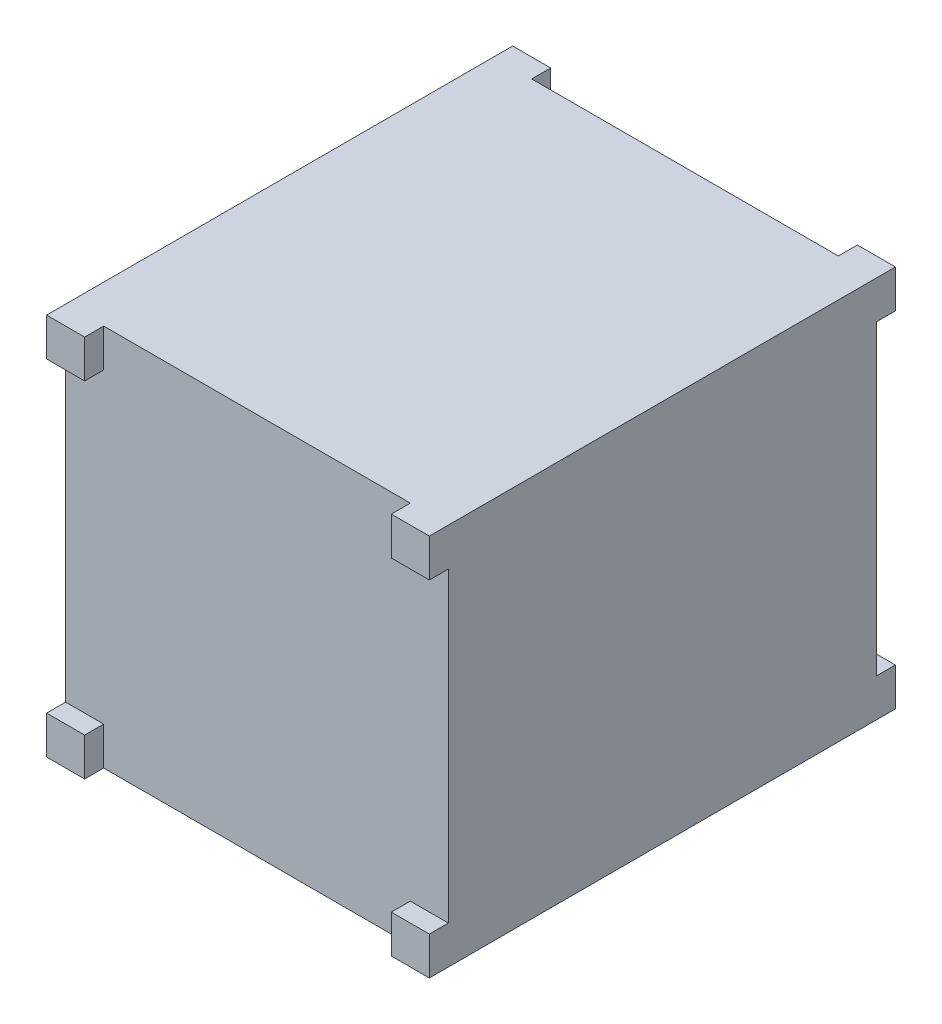
ISO-10303-21;
HEADER;
FILE_DESCRIPTION(('STEP AP214'),'2;1');
FILE_NAME('part.step','',(''),(''),'','','');
FILE_SCHEMA(('AUTOMOTIVE_DESIGN { 1 0 10303 214 1 1 1 1 }'));
ENDSEC;
DATA;
#1=APPLICATION_CONTEXT('core data for automotive mechanical design processes');
#2=APPLICATION_PROTOCOL_DEFINITION('international standard','automotive_design',2000,#1);
#3=PRODUCT_CONTEXT('',#1,'mechanical');
#4=PRODUCT('Part','Part','',(#3));
#5=PRODUCT_RELATED_PRODUCT_CATEGORY('part','',(#4));
#6=PRODUCT_DEFINITION_FORMATION('','',#4);
#7=PRODUCT_DEFINITION_CONTEXT('part definition',#1,'design');
#8=PRODUCT_DEFINITION('design','',#6,#7);
#9=PRODUCT_DEFINITION_SHAPE('','',#8);
#10=(LENGTH_UNIT() NAMED_UNIT(*) SI_UNIT(.MILLI.,.METRE.));
#11=(NAMED_UNIT(*) PLANE_ANGLE_UNIT() SI_UNIT($,.RADIAN.));
#12=(NAMED_UNIT(*) SI_UNIT($,.STERADIAN.) SOLID_ANGLE_UNIT());
#13=UNCERTAINTY_MEASURE_WITH_UNIT(LENGTH_MEASURE(1.E-05),#10,'distance_accuracy_value','');
#14=(GEOMETRIC_REPRESENTATION_CONTEXT(3) GLOBAL_UNCERTAINTY_ASSIGNED_CONTEXT((#13)) GLOBAL_UNIT_ASSIGNED_CONTEXT((#10,
#11,#12)) REPRESENTATION_CONTEXT('',''));
#15=CARTESIAN_POINT('',(0.,0.,0.));
#16=DIRECTION('',(0.,0.,1.));
#17=DIRECTION('',(1.,0.,0.));
#18=AXIS2_PLACEMENT_3D('',#15,#16,#17);
#19=CARTESIAN_POINT('',(0.,0.,-56.25));
#20=DIRECTION('',(0.,0.,1.));
#21=DIRECTION('',(1.,0.,0.));
#22=AXIS2_PLACEMENT_3D('',#19,#20,#21);
#23=PLANE('',#22);
#24=DIRECTION('',(0.,1.,0.));
#25=VECTOR('',#24,1.);
#26=CARTESIAN_POINT('',(40.3,-50.3,-56.25));
#27=LINE('',#26,#25);
#28=CARTESIAN_POINT('',(40.3,-50.3,-56.25));
#29=VERTEX_POINT('',#28);
#30=CARTESIAN_POINT('',(40.3,-40.3,-56.25));
#31=VERTEX_POINT('',#30);
#32=EDGE_CURVE('E240',#29,#31,#27,.T.);
#33=ORIENTED_EDGE('',*,*,#32,.F.);
#34=DIRECTION('',(1.,0.,0.));
#35=VECTOR('',#34,1.);
#36=CARTESIAN_POINT('',(50.3,-50.3,-56.25));
#37=LINE('',#36,#35);
#38=CARTESIAN_POINT('',(-40.2999999999999,-50.3,-56.25));
#39=VERTEX_POINT('',#38);
#40=EDGE_CURVE('E422',#39,#29,#37,.T.);
#41=ORIENTED_EDGE('',*,*,#40,.F.);
#42=DIRECTION('',(0.,-1.,0.));
#43=VECTOR('',#42,1.);
#44=CARTESIAN_POINT('',(-40.3,-50.3,-56.25));
#45=LINE('',#44,#43);
#46=CARTESIAN_POINT('',(-40.3,-40.3000000000001,-56.25));
#47=VERTEX_POINT('',#46);
#48=EDGE_CURVE('E256',#47,#39,#45,.T.);
#49=ORIENTED_EDGE('',*,*,#48,.F.);
#50=DIRECTION('',(1.,0.,0.));
#51=VECTOR('',#50,1.);
#52=CARTESIAN_POINT('',(-50.3,-40.3000000000001,-56.25));
#53=LINE('',#52,#51);
#54=CARTESIAN_POINT('',(-50.3,-40.3000000000001,-56.25));
#55=VERTEX_POINT('',#54);
#56=EDGE_CURVE('E251',#55,#47,#53,.T.);
#57=ORIENTED_EDGE('',*,*,#56,.F.);
#58=DIRECTION('',(0.,-1.,0.));
#59=VECTOR('',#58,1.);
#60=CARTESIAN_POINT('',(-50.3,-50.3,-56.25));
#61=LINE('',#60,#59);
#62=CARTESIAN_POINT('',(-50.3,40.3000000000001,-56.25));
#63=VERTEX_POINT('',#62);
#64=EDGE_CURVE('E409',#63,#55,#61,.T.);
#65=ORIENTED_EDGE('',*,*,#64,.F.);
#66=DIRECTION('',(-1.,0.,0.));
#67=VECTOR('',#66,1.);
#68=CARTESIAN_POINT('',(-50.3,40.3000000000001,-56.25));
#69=LINE('',#68,#67);
#70=CARTESIAN_POINT('',(-40.3,40.3000000000001,-56.25));
#71=VERTEX_POINT('',#70);
#72=EDGE_CURVE('E275',#71,#63,#69,.T.);
#73=ORIENTED_EDGE('',*,*,#72,.F.);
#74=DIRECTION('',(0.,-1.,0.));
#75=VECTOR('',#74,1.);
#76=CARTESIAN_POINT('',(-40.2999999999999,50.3000000000001,-56.25));
#77=LINE('',#76,#75);
#78=CARTESIAN_POINT('',(-40.2999999999999,50.3000000000001,-56.25));
#79=VERTEX_POINT('',#78);
#80=EDGE_CURVE('E270',#79,#71,#77,.T.);
#81=ORIENTED_EDGE('',*,*,#80,.F.);
#82=DIRECTION('',(-1.,0.,0.));
#83=VECTOR('',#82,1.);
#84=CARTESIAN_POINT('',(50.3,50.3,-56.25));
#85=LINE('',#84,#83);
#86=CARTESIAN_POINT('',(40.3,50.3,-56.25));
#87=VERTEX_POINT('',#86);
#88=EDGE_CURVE('E413',#87,#79,#85,.T.);
#89=ORIENTED_EDGE('',*,*,#88,.F.);
#90=DIRECTION('',(0.,1.,0.));
#91=VECTOR('',#90,1.);
#92=CARTESIAN_POINT('',(40.3,50.3,-56.25));
#93=LINE('',#92,#91);
#94=CARTESIAN_POINT('',(40.3,40.3,-56.25));
#95=VERTEX_POINT('',#94);
#96=EDGE_CURVE('E296',#95,#87,#93,.T.);
#97=ORIENTED_EDGE('',*,*,#96,.F.);
#98=DIRECTION('',(-1.,0.,0.));
#99=VECTOR('',#98,1.);
#100=CARTESIAN_POINT('',(50.3,40.3,-56.25));
#101=LINE('',#100,#99);
#102=CARTESIAN_POINT('',(50.3,40.3,-56.25));
#103=VERTEX_POINT('',#102);
#104=EDGE_CURVE('E291',#103,#95,#101,.T.);
#105=ORIENTED_EDGE('',*,*,#104,.F.);
#106=DIRECTION('',(0.,1.,0.));
#107=VECTOR('',#106,1.);
#108=CARTESIAN_POINT('',(50.3,-50.3,-56.25));
#109=LINE('',#108,#107);
#110=CARTESIAN_POINT('',(50.3,-40.3,-56.25));
#111=VERTEX_POINT('',#110);
#112=EDGE_CURVE('E424',#111,#103,#109,.T.);
#113=ORIENTED_EDGE('',*,*,#112,.F.);
#114=DIRECTION('',(1.,0.,0.));
#115=VECTOR('',#114,1.);
#116=CARTESIAN_POINT('',(50.3,-40.3,-56.25));
#117=LINE('',#116,#115);
#118=EDGE_CURVE('E238',#31,#111,#117,.T.);
#119=ORIENTED_EDGE('',*,*,#118,.F.);
#120=EDGE_LOOP('',(#33,#41,#49,#57,#65,#73,#81,#89,#97,#105,#113,#119));
#121=FACE_BOUND('',#120,.T.);
#122=ADVANCED_FACE('F33',(#121),#23,.F.);
#123=CARTESIAN_POINT('',(0.,0.,56.25));
#124=DIRECTION('',(0.,0.,1.));
#125=DIRECTION('',(1.,0.,0.));
#126=AXIS2_PLACEMENT_3D('',#123,#124,#125);
#127=PLANE('',#126);
#128=DIRECTION('',(-1.,0.,0.));
#129=VECTOR('',#128,1.);
#130=CARTESIAN_POINT('',(-50.3,-40.3,56.25));
#131=LINE('',#130,#129);
#132=CARTESIAN_POINT('',(-40.3,-40.3,56.25));
#133=VERTEX_POINT('',#132);
#134=CARTESIAN_POINT('',(-50.3,-40.3,56.25));
#135=VERTEX_POINT('',#134);
#136=EDGE_CURVE('E321',#133,#135,#131,.T.);
#137=ORIENTED_EDGE('',*,*,#136,.F.);
#138=DIRECTION('',(0.,1.,0.));
#139=VECTOR('',#138,1.);
#140=CARTESIAN_POINT('',(-40.3,-50.3,56.25));
#141=LINE('',#140,#139);
#142=CARTESIAN_POINT('',(-40.3,-50.3,56.25));
#143=VERTEX_POINT('',#142);
#144=EDGE_CURVE('E316',#143,#133,#141,.T.);
#145=ORIENTED_EDGE('',*,*,#144,.F.);
#146=DIRECTION('',(1.,0.,0.));
#147=VECTOR('',#146,1.);
#148=CARTESIAN_POINT('',(50.3,-50.3,56.25));
#149=LINE('',#148,#147);
#150=CARTESIAN_POINT('',(40.3,-50.3,56.25));
#151=VERTEX_POINT('',#150);
#152=EDGE_CURVE('E412',#143,#151,#149,.T.);
#153=ORIENTED_EDGE('',*,*,#152,.T.);
#154=DIRECTION('',(0.,-1.,0.));
#155=VECTOR('',#154,1.);
#156=CARTESIAN_POINT('',(40.3,-50.3,56.25));
#157=LINE('',#156,#155);
#158=CARTESIAN_POINT('',(40.3,-40.3,56.25));
#159=VERTEX_POINT('',#158);
#160=EDGE_CURVE('E343',#159,#151,#157,.T.);
#161=ORIENTED_EDGE('',*,*,#160,.F.);
#162=DIRECTION('',(-1.,0.,0.));
#163=VECTOR('',#162,1.);
#164=CARTESIAN_POINT('',(50.3,-40.3,56.25));
#165=LINE('',#164,#163);
#166=CARTESIAN_POINT('',(50.3,-40.3,56.25));
#167=VERTEX_POINT('',#166);
#168=EDGE_CURVE('E340',#167,#159,#165,.T.);
#169=ORIENTED_EDGE('',*,*,#168,.F.);
#170=DIRECTION('',(0.,1.,0.));
#171=VECTOR('',#170,1.);
#172=CARTESIAN_POINT('',(50.3,-50.3,56.25));
#173=LINE('',#172,#171);
#174=CARTESIAN_POINT('',(50.3,40.3,56.25));
#175=VERTEX_POINT('',#174);
#176=EDGE_CURVE('E415',#167,#175,#173,.T.);
#177=ORIENTED_EDGE('',*,*,#176,.T.);
#178=DIRECTION('',(1.,0.,0.));
#179=VECTOR('',#178,1.);
#180=CARTESIAN_POINT('',(50.3,40.3,56.25));
#181=LINE('',#180,#179);
#182=CARTESIAN_POINT('',(40.3,40.3,56.25));
#183=VERTEX_POINT('',#182);
#184=EDGE_CURVE('E367',#183,#175,#181,.T.);
#185=ORIENTED_EDGE('',*,*,#184,.F.);
#186=DIRECTION('',(0.,-1.,0.));
#187=VECTOR('',#186,1.);
#188=CARTESIAN_POINT('',(40.3,50.3,56.25));
#189=LINE('',#188,#187);
#190=CARTESIAN_POINT('',(40.3,50.3,56.25));
#191=VERTEX_POINT('',#190);
#192=EDGE_CURVE('E362',#191,#183,#189,.T.);
#193=ORIENTED_EDGE('',*,*,#192,.F.);
#194=DIRECTION('',(-1.,0.,0.));
#195=VECTOR('',#194,1.);
#196=CARTESIAN_POINT('',(50.3,50.3,56.25));
#197=LINE('',#196,#195);
#198=CARTESIAN_POINT('',(-40.2999999999999,50.3,56.25));
#199=VERTEX_POINT('',#198);
#200=EDGE_CURVE('E417',#191,#199,#197,.T.);
#201=ORIENTED_EDGE('',*,*,#200,.T.);
#202=DIRECTION('',(0.,1.,0.));
#203=VECTOR('',#202,1.);
#204=CARTESIAN_POINT('',(-40.3,50.3,56.25));
#205=LINE('',#204,#203);
#206=CARTESIAN_POINT('',(-40.3,40.3,56.25));
#207=VERTEX_POINT('',#206);
#208=EDGE_CURVE('E389',#207,#199,#205,.T.);
#209=ORIENTED_EDGE('',*,*,#208,.F.);
#210=DIRECTION('',(1.,0.,0.));
#211=VECTOR('',#210,1.);
#212=CARTESIAN_POINT('',(-50.3,40.3,56.25));
#213=LINE('',#212,#211);
#214=CARTESIAN_POINT('',(-50.3,40.3,56.25));
#215=VERTEX_POINT('',#214);
#216=EDGE_CURVE('E384',#215,#207,#213,.T.);
#217=ORIENTED_EDGE('',*,*,#216,.F.);
#218=DIRECTION('',(0.,-1.,0.));
#219=VECTOR('',#218,1.);
#220=CARTESIAN_POINT('',(-50.3,-50.3,56.25));
#221=LINE('',#220,#219);
#222=EDGE_CURVE('E410',#215,#135,#221,.T.);
#223=ORIENTED_EDGE('',*,*,#222,.T.);
#224=EDGE_LOOP('',(#137,#145,#153,#161,#169,#177,#185,#193,#201,#209,#217,#223));
#225=FACE_BOUND('',#224,.T.);
#226=ADVANCED_FACE('F484',(#225),#127,.T.);
#227=CARTESIAN_POINT('',(-50.3,-50.3,56.25));
#228=DIRECTION('',(1.,0.,0.));
#229=DIRECTION('',(0.,0.,-1.));
#230=AXIS2_PLACEMENT_3D('',#227,#228,#229);
#231=PLANE('',#230);
#232=DIRECTION('',(0.,0.,-1.));
#233=VECTOR('',#232,1.);
#234=CARTESIAN_POINT('',(-50.3,50.3,56.25));
#235=LINE('',#234,#233);
#236=CARTESIAN_POINT('',(-50.3,50.3,61.25));
#237=VERTEX_POINT('',#236);
#238=CARTESIAN_POINT('',(-50.2999999999999,50.3000000000001,-61.25));
#239=VERTEX_POINT('',#238);
#240=EDGE_CURVE('E419',#237,#239,#235,.T.);
#241=ORIENTED_EDGE('',*,*,#240,.T.);
#242=DIRECTION('',(0.,1.,0.));
#243=VECTOR('',#242,1.);
#244=CARTESIAN_POINT('',(-50.2999999999999,50.3000000000001,-61.25));
#245=LINE('',#244,#243);
#246=CARTESIAN_POINT('',(-50.3,40.3000000000001,-61.25));
#247=VERTEX_POINT('',#246);
#248=EDGE_CURVE('E271',#247,#239,#245,.T.);
#249=ORIENTED_EDGE('',*,*,#248,.F.);
#250=DIRECTION('',(0.,0.,1.));
#251=VECTOR('',#250,1.);
#252=CARTESIAN_POINT('',(-50.3,40.3000000000001,-61.25));
#253=LINE('',#252,#251);
#254=EDGE_CURVE('E281',#247,#63,#253,.T.);
#255=ORIENTED_EDGE('',*,*,#254,.T.);
#256=ORIENTED_EDGE('',*,*,#64,.T.);
#257=DIRECTION('',(0.,0.,1.));
#258=VECTOR('',#257,1.);
#259=CARTESIAN_POINT('',(-50.3,-40.3000000000001,-61.25));
#260=LINE('',#259,#258);
#261=CARTESIAN_POINT('',(-50.3,-40.3000000000001,-61.25));
#262=VERTEX_POINT('',#261);
#263=EDGE_CURVE('E268',#262,#55,#260,.T.);
#264=ORIENTED_EDGE('',*,*,#263,.F.);
#265=DIRECTION('',(0.,1.,0.));
#266=VECTOR('',#265,1.);
#267=CARTESIAN_POINT('',(-50.3,-50.3000000000001,-61.25));
#268=LINE('',#267,#266);
#269=CARTESIAN_POINT('',(-50.3,-50.3000000000001,-61.25));
#270=VERTEX_POINT('',#269);
#271=EDGE_CURVE('E255',#270,#262,#268,.T.);
#272=ORIENTED_EDGE('',*,*,#271,.F.);
#273=DIRECTION('',(0.,0.,-1.));
#274=VECTOR('',#273,1.);
#275=CARTESIAN_POINT('',(-50.3,-50.3,56.25));
#276=LINE('',#275,#274);
#277=CARTESIAN_POINT('',(-50.3,-50.3,61.25));
#278=VERTEX_POINT('',#277);
#279=EDGE_CURVE('E11',#278,#270,#276,.T.);
#280=ORIENTED_EDGE('',*,*,#279,.F.);
#281=DIRECTION('',(0.,-1.,0.));
#282=VECTOR('',#281,1.);
#283=CARTESIAN_POINT('',(-50.3,-50.3,61.25));
#284=LINE('',#283,#282);
#285=CARTESIAN_POINT('',(-50.3,-40.3,61.25));
#286=VERTEX_POINT('',#285);
#287=EDGE_CURVE('E317',#286,#278,#284,.T.);
#288=ORIENTED_EDGE('',*,*,#287,.F.);
#289=DIRECTION('',(0.,0.,-1.));
#290=VECTOR('',#289,1.);
#291=CARTESIAN_POINT('',(-50.3,-40.3,61.25));
#292=LINE('',#291,#290);
#293=EDGE_CURVE('E327',#286,#135,#292,.T.);
#294=ORIENTED_EDGE('',*,*,#293,.T.);
#295=ORIENTED_EDGE('',*,*,#222,.F.);
#296=DIRECTION('',(0.,0.,-1.));
#297=VECTOR('',#296,1.);
#298=CARTESIAN_POINT('',(-50.3,40.3,61.25));
#299=LINE('',#298,#297);
#300=CARTESIAN_POINT('',(-50.3,40.3,61.25));
#301=VERTEX_POINT('',#300);
#302=EDGE_CURVE('E406',#301,#215,#299,.T.);
#303=ORIENTED_EDGE('',*,*,#302,.F.);
#304=DIRECTION('',(0.,-1.,0.));
#305=VECTOR('',#304,1.);
#306=CARTESIAN_POINT('',(-50.3,50.3,61.25));
#307=LINE('',#306,#305);
#308=EDGE_CURVE('E385',#237,#301,#307,.T.);
#309=ORIENTED_EDGE('',*,*,#308,.F.);
#310=EDGE_LOOP('',(#241,#249,#255,#256,#264,#272,#280,#288,#294,#295,#303,#309));
#311=FACE_BOUND('',#310,.T.);
#312=ADVANCED_FACE('F35',(#311),#231,.F.);
#313=CARTESIAN_POINT('',(50.3,-50.3,56.25));
#314=DIRECTION('',(0.,1.,0.));
#315=DIRECTION('',(0.,0.,1.));
#316=AXIS2_PLACEMENT_3D('',#313,#314,#315);
#317=PLANE('',#316);
#318=ORIENTED_EDGE('',*,*,#279,.T.);
#319=DIRECTION('',(-1.,0.,0.));
#320=VECTOR('',#319,1.);
#321=CARTESIAN_POINT('',(-50.3,-50.3000000000001,-61.25));
#322=LINE('',#321,#320);
#323=CARTESIAN_POINT('',(-40.3,-50.3,-61.25));
#324=VERTEX_POINT('',#323);
#325=EDGE_CURVE('E252',#324,#270,#322,.T.);
#326=ORIENTED_EDGE('',*,*,#325,.F.);
#327=DIRECTION('',(0.,0.,1.));
#328=VECTOR('',#327,1.);
#329=CARTESIAN_POINT('',(-40.3,-50.3,-61.25));
#330=LINE('',#329,#328);
#331=EDGE_CURVE('E56',#324,#39,#330,.T.);
#332=ORIENTED_EDGE('',*,*,#331,.T.);
#333=ORIENTED_EDGE('',*,*,#40,.T.);
#334=DIRECTION('',(0.,0.,1.));
#335=VECTOR('',#334,1.);
#336=CARTESIAN_POINT('',(40.3,-50.3,-61.25));
#337=LINE('',#336,#335);
#338=CARTESIAN_POINT('',(40.3,-50.3,-61.25));
#339=VERTEX_POINT('',#338);
#340=EDGE_CURVE('E230',#339,#29,#337,.T.);
#341=ORIENTED_EDGE('',*,*,#340,.F.);
#342=DIRECTION('',(-1.,0.,0.));
#343=VECTOR('',#342,1.);
#344=CARTESIAN_POINT('',(50.3,-50.3,-61.25));
#345=LINE('',#344,#343);
#346=CARTESIAN_POINT('',(50.3,-50.3,-61.25));
#347=VERTEX_POINT('',#346);
#348=EDGE_CURVE('E228',#347,#339,#345,.T.);
#349=ORIENTED_EDGE('',*,*,#348,.F.);
#350=DIRECTION('',(0.,0.,-1.));
#351=VECTOR('',#350,1.);
#352=CARTESIAN_POINT('',(50.3,-50.3,56.25));
#353=LINE('',#352,#351);
#354=CARTESIAN_POINT('',(50.3,-50.3,61.25));
#355=VERTEX_POINT('',#354);
#356=EDGE_CURVE('E41',#355,#347,#353,.T.);
#357=ORIENTED_EDGE('',*,*,#356,.F.);
#358=DIRECTION('',(1.,0.,0.));
#359=VECTOR('',#358,1.);
#360=CARTESIAN_POINT('',(50.3,-50.3,61.25));
#361=LINE('',#360,#359);
#362=CARTESIAN_POINT('',(40.3,-50.3,61.25));
#363=VERTEX_POINT('',#362);
#364=EDGE_CURVE('E341',#363,#355,#361,.T.);
#365=ORIENTED_EDGE('',*,*,#364,.F.);
#366=DIRECTION('',(0.,0.,-1.));
#367=VECTOR('',#366,1.);
#368=CARTESIAN_POINT('',(40.3,-50.3,61.25));
#369=LINE('',#368,#367);
#370=EDGE_CURVE('E349',#363,#151,#369,.T.);
#371=ORIENTED_EDGE('',*,*,#370,.T.);
#372=ORIENTED_EDGE('',*,*,#152,.F.);
#373=DIRECTION('',(0.,0.,-1.));
#374=VECTOR('',#373,1.);
#375=CARTESIAN_POINT('',(-40.3,-50.3,61.25));
#376=LINE('',#375,#374);
#377=CARTESIAN_POINT('',(-40.3,-50.3,61.25));
#378=VERTEX_POINT('',#377);
#379=EDGE_CURVE('E337',#378,#143,#376,.T.);
#380=ORIENTED_EDGE('',*,*,#379,.F.);
#381=DIRECTION('',(1.,0.,0.));
#382=VECTOR('',#381,1.);
#383=CARTESIAN_POINT('',(-50.3,-50.3,61.25));
#384=LINE('',#383,#382);
#385=EDGE_CURVE('E320',#278,#378,#384,.T.);
#386=ORIENTED_EDGE('',*,*,#385,.F.);
#387=EDGE_LOOP('',(#318,#326,#332,#333,#341,#349,#357,#365,#371,#372,#380,#386));
#388=FACE_BOUND('',#387,.T.);
#389=ADVANCED_FACE('F229',(#388),#317,.F.);
#390=CARTESIAN_POINT('',(50.3,-50.3,56.25));
#391=DIRECTION('',(-1.,0.,0.));
#392=DIRECTION('',(0.,0.,1.));
#393=AXIS2_PLACEMENT_3D('',#390,#391,#392);
#394=PLANE('',#393);
#395=ORIENTED_EDGE('',*,*,#356,.T.);
#396=DIRECTION('',(0.,-1.,0.));
#397=VECTOR('',#396,1.);
#398=CARTESIAN_POINT('',(50.3,-50.3,-61.25));
#399=LINE('',#398,#397);
#400=CARTESIAN_POINT('',(50.3,-40.3,-61.25));
#401=VERTEX_POINT('',#400);
#402=EDGE_CURVE('E221',#401,#347,#399,.T.);
#403=ORIENTED_EDGE('',*,*,#402,.F.);
#404=DIRECTION('',(0.,0.,1.));
#405=VECTOR('',#404,1.);
#406=CARTESIAN_POINT('',(50.3,-40.3,-61.25));
#407=LINE('',#406,#405);
#408=EDGE_CURVE('E48',#401,#111,#407,.T.);
#409=ORIENTED_EDGE('',*,*,#408,.T.);
#410=ORIENTED_EDGE('',*,*,#112,.T.);
#411=DIRECTION('',(0.,0.,1.));
#412=VECTOR('',#411,1.);
#413=CARTESIAN_POINT('',(50.3,40.3,-61.25));
#414=LINE('',#413,#412);
#415=CARTESIAN_POINT('',(50.3,40.3,-61.25));
#416=VERTEX_POINT('',#415);
#417=EDGE_CURVE('E313',#416,#103,#414,.T.);
#418=ORIENTED_EDGE('',*,*,#417,.F.);
#419=DIRECTION('',(0.,-1.,0.));
#420=VECTOR('',#419,1.);
#421=CARTESIAN_POINT('',(50.3,50.3,-61.25));
#422=LINE('',#421,#420);
#423=CARTESIAN_POINT('',(50.3,50.3,-61.25));
#424=VERTEX_POINT('',#423);
#425=EDGE_CURVE('E292',#424,#416,#422,.T.);
#426=ORIENTED_EDGE('',*,*,#425,.F.);
#427=DIRECTION('',(0.,0.,-1.));
#428=VECTOR('',#427,1.);
#429=CARTESIAN_POINT('',(50.3,50.3,56.25));
#430=LINE('',#429,#428);
#431=CARTESIAN_POINT('',(50.3,50.3,61.25));
#432=VERTEX_POINT('',#431);
#433=EDGE_CURVE('E226',#432,#424,#430,.T.);
#434=ORIENTED_EDGE('',*,*,#433,.F.);
#435=DIRECTION('',(0.,1.,0.));
#436=VECTOR('',#435,1.);
#437=CARTESIAN_POINT('',(50.3,50.3,61.25));
#438=LINE('',#437,#436);
#439=CARTESIAN_POINT('',(50.3,40.3,61.25));
#440=VERTEX_POINT('',#439);
#441=EDGE_CURVE('E363',#440,#432,#438,.T.);
#442=ORIENTED_EDGE('',*,*,#441,.F.);
#443=DIRECTION('',(0.,0.,-1.));
#444=VECTOR('',#443,1.);
#445=CARTESIAN_POINT('',(50.3,40.3,61.25));
#446=LINE('',#445,#444);
#447=EDGE_CURVE('E373',#440,#175,#446,.T.);
#448=ORIENTED_EDGE('',*,*,#447,.T.);
#449=ORIENTED_EDGE('',*,*,#176,.F.);
#450=DIRECTION('',(0.,0.,-1.));
#451=VECTOR('',#450,1.);
#452=CARTESIAN_POINT('',(50.3,-40.3,61.25));
#453=LINE('',#452,#451);
#454=CARTESIAN_POINT('',(50.3,-40.3,61.25));
#455=VERTEX_POINT('',#454);
#456=EDGE_CURVE('E359',#455,#167,#453,.T.);
#457=ORIENTED_EDGE('',*,*,#456,.F.);
#458=DIRECTION('',(0.,1.,0.));
#459=VECTOR('',#458,1.);
#460=CARTESIAN_POINT('',(50.3,-50.3,61.25));
#461=LINE('',#460,#459);
#462=EDGE_CURVE('E223',#355,#455,#461,.T.);
#463=ORIENTED_EDGE('',*,*,#462,.F.);
#464=EDGE_LOOP('',(#395,#403,#409,#410,#418,#426,#434,#442,#448,#449,#457,#463));
#465=FACE_BOUND('',#464,.T.);
#466=ADVANCED_FACE('F219',(#465),#394,.F.);
#467=CARTESIAN_POINT('',(50.3,50.3,56.25));
#468=DIRECTION('',(0.,-1.,0.));
#469=DIRECTION('',(1.,0.,0.));
#470=AXIS2_PLACEMENT_3D('',#467,#468,#469);
#471=PLANE('',#470);
#472=ORIENTED_EDGE('',*,*,#433,.T.);
#473=DIRECTION('',(1.,0.,0.));
#474=VECTOR('',#473,1.);
#475=CARTESIAN_POINT('',(50.3,50.3,-61.25));
#476=LINE('',#475,#474);
#477=CARTESIAN_POINT('',(40.3,50.3,-61.25));
#478=VERTEX_POINT('',#477);
#479=EDGE_CURVE('E300',#478,#424,#476,.T.);
#480=ORIENTED_EDGE('',*,*,#479,.F.);
#481=DIRECTION('',(0.,0.,1.));
#482=VECTOR('',#481,1.);
#483=CARTESIAN_POINT('',(40.3,50.3,-61.25));
#484=LINE('',#483,#482);
#485=EDGE_CURVE('E303',#478,#87,#484,.T.);
#486=ORIENTED_EDGE('',*,*,#485,.T.);
#487=ORIENTED_EDGE('',*,*,#88,.T.);
#488=DIRECTION('',(0.,0.,1.));
#489=VECTOR('',#488,1.);
#490=CARTESIAN_POINT('',(-40.2999999999999,50.3000000000001,-61.25));
#491=LINE('',#490,#489);
#492=CARTESIAN_POINT('',(-40.2999999999999,50.3000000000001,-61.25));
#493=VERTEX_POINT('',#492);
#494=EDGE_CURVE('E289',#493,#79,#491,.T.);
#495=ORIENTED_EDGE('',*,*,#494,.F.);
#496=DIRECTION('',(1.,0.,0.));
#497=VECTOR('',#496,1.);
#498=CARTESIAN_POINT('',(-50.2999999999999,50.3000000000001,-61.25));
#499=LINE('',#498,#497);
#500=EDGE_CURVE('E274',#239,#493,#499,.T.);
#501=ORIENTED_EDGE('',*,*,#500,.F.);
#502=ORIENTED_EDGE('',*,*,#240,.F.);
#503=DIRECTION('',(-1.,0.,0.));
#504=VECTOR('',#503,1.);
#505=CARTESIAN_POINT('',(-50.3,50.3,61.25));
#506=LINE('',#505,#504);
#507=CARTESIAN_POINT('',(-40.3,50.3,61.25));
#508=VERTEX_POINT('',#507);
#509=EDGE_CURVE('E393',#508,#237,#506,.T.);
#510=ORIENTED_EDGE('',*,*,#509,.F.);
#511=DIRECTION('',(0.,0.,-1.));
#512=VECTOR('',#511,1.);
#513=CARTESIAN_POINT('',(-40.3,50.3,61.25));
#514=LINE('',#513,#512);
#515=EDGE_CURVE('E396',#508,#199,#514,.T.);
#516=ORIENTED_EDGE('',*,*,#515,.T.);
#517=ORIENTED_EDGE('',*,*,#200,.F.);
#518=DIRECTION('',(0.,0.,-1.));
#519=VECTOR('',#518,1.);
#520=CARTESIAN_POINT('',(40.3,50.3,61.25));
#521=LINE('',#520,#519);
#522=CARTESIAN_POINT('',(40.3,50.3,61.25));
#523=VERTEX_POINT('',#522);
#524=EDGE_CURVE('E382',#523,#191,#521,.T.);
#525=ORIENTED_EDGE('',*,*,#524,.F.);
#526=DIRECTION('',(-1.,0.,0.));
#527=VECTOR('',#526,1.);
#528=CARTESIAN_POINT('',(50.3,50.3,61.25));
#529=LINE('',#528,#527);
#530=EDGE_CURVE('E366',#432,#523,#529,.T.);
#531=ORIENTED_EDGE('',*,*,#530,.F.);
#532=EDGE_LOOP('',(#472,#480,#486,#487,#495,#501,#502,#510,#516,#517,#525,#531));
#533=FACE_BOUND('',#532,.T.);
#534=ADVANCED_FACE('F432',(#533),#471,.F.);
#535=CARTESIAN_POINT('',(-50.3,40.3,61.25));
#536=DIRECTION('',(0.,1.,0.));
#537=DIRECTION('',(0.,0.,1.));
#538=AXIS2_PLACEMENT_3D('',#535,#536,#537);
#539=PLANE('',#538);
#540=ORIENTED_EDGE('',*,*,#216,.T.);
#541=DIRECTION('',(0.,0.,-1.));
#542=VECTOR('',#541,1.);
#543=CARTESIAN_POINT('',(-40.3,40.3,61.25));
#544=LINE('',#543,#542);
#545=CARTESIAN_POINT('',(-40.3,40.3,61.25));
#546=VERTEX_POINT('',#545);
#547=EDGE_CURVE('E403',#546,#207,#544,.T.);
#548=ORIENTED_EDGE('',*,*,#547,.F.);
#549=DIRECTION('',(1.,0.,0.));
#550=VECTOR('',#549,1.);
#551=CARTESIAN_POINT('',(-50.3,40.3,61.25));
#552=LINE('',#551,#550);
#553=EDGE_CURVE('E388',#301,#546,#552,.T.);
#554=ORIENTED_EDGE('',*,*,#553,.F.);
#555=ORIENTED_EDGE('',*,*,#302,.T.);
#556=EDGE_LOOP('',(#540,#548,#554,#555));
#557=FACE_BOUND('',#556,.T.);
#558=ADVANCED_FACE('F476',(#557),#539,.F.);
#559=CARTESIAN_POINT('',(-40.3,50.3,61.25));
#560=DIRECTION('',(-1.,0.,0.));
#561=DIRECTION('',(0.,0.,1.));
#562=AXIS2_PLACEMENT_3D('',#559,#560,#561);
#563=PLANE('',#562);
#564=ORIENTED_EDGE('',*,*,#208,.T.);
#565=ORIENTED_EDGE('',*,*,#515,.F.);
#566=DIRECTION('',(0.,1.,0.));
#567=VECTOR('',#566,1.);
#568=CARTESIAN_POINT('',(-40.3,50.3,61.25));
#569=LINE('',#568,#567);
#570=EDGE_CURVE('E391',#546,#508,#569,.T.);
#571=ORIENTED_EDGE('',*,*,#570,.F.);
#572=ORIENTED_EDGE('',*,*,#547,.T.);
#573=EDGE_LOOP('',(#564,#565,#571,#572));
#574=FACE_BOUND('',#573,.T.);
#575=ADVANCED_FACE('F479',(#574),#563,.F.);
#576=CARTESIAN_POINT('',(0.,0.,61.25));
#577=DIRECTION('',(0.,0.,1.));
#578=DIRECTION('',(1.,0.,0.));
#579=AXIS2_PLACEMENT_3D('',#576,#577,#578);
#580=PLANE('',#579);
#581=ORIENTED_EDGE('',*,*,#308,.T.);
#582=ORIENTED_EDGE('',*,*,#553,.T.);
#583=ORIENTED_EDGE('',*,*,#570,.T.);
#584=ORIENTED_EDGE('',*,*,#509,.T.);
#585=EDGE_LOOP('',(#581,#582,#583,#584));
#586=FACE_BOUND('',#585,.T.);
#587=ADVANCED_FACE('F470',(#586),#580,.T.);
#588=CARTESIAN_POINT('',(40.3,50.3,61.25));
#589=DIRECTION('',(1.,0.,0.));
#590=DIRECTION('',(0.,0.,-1.));
#591=AXIS2_PLACEMENT_3D('',#588,#589,#590);
#592=PLANE('',#591);
#593=ORIENTED_EDGE('',*,*,#192,.T.);
#594=DIRECTION('',(0.,0.,-1.));
#595=VECTOR('',#594,1.);
#596=CARTESIAN_POINT('',(40.3,40.3,61.25));
#597=LINE('',#596,#595);
#598=CARTESIAN_POINT('',(40.3,40.3,61.25));
#599=VERTEX_POINT('',#598);
#600=EDGE_CURVE('E380',#599,#183,#597,.T.);
#601=ORIENTED_EDGE('',*,*,#600,.F.);
#602=DIRECTION('',(0.,-1.,0.));
#603=VECTOR('',#602,1.);
#604=CARTESIAN_POINT('',(40.3,50.3,61.25));
#605=LINE('',#604,#603);
#606=EDGE_CURVE('E369',#523,#599,#605,.T.);
#607=ORIENTED_EDGE('',*,*,#606,.F.);
#608=ORIENTED_EDGE('',*,*,#524,.T.);
#609=EDGE_LOOP('',(#593,#601,#607,#608));
#610=FACE_BOUND('',#609,.T.);
#611=ADVANCED_FACE('F488',(#610),#592,.F.);
#612=CARTESIAN_POINT('',(50.3,40.3,61.25));
#613=DIRECTION('',(0.,1.,0.));
#614=DIRECTION('',(-1.,0.,0.));
#615=AXIS2_PLACEMENT_3D('',#612,#613,#614);
#616=PLANE('',#615);
#617=ORIENTED_EDGE('',*,*,#184,.T.);
#618=ORIENTED_EDGE('',*,*,#447,.F.);
#619=DIRECTION('',(1.,0.,0.));
#620=VECTOR('',#619,1.);
#621=CARTESIAN_POINT('',(50.3,40.3,61.25));
#622=LINE('',#621,#620);
#623=EDGE_CURVE('E371',#599,#440,#622,.T.);
#624=ORIENTED_EDGE('',*,*,#623,.F.);
#625=ORIENTED_EDGE('',*,*,#600,.T.);
#626=EDGE_LOOP('',(#617,#618,#624,#625));
#627=FACE_BOUND('',#626,.T.);
#628=ADVANCED_FACE('F495',(#627),#616,.F.);
#629=CARTESIAN_POINT('',(0.,0.,61.25));
#630=DIRECTION('',(0.,0.,-1.));
#631=DIRECTION('',(-1.,0.,0.));
#632=AXIS2_PLACEMENT_3D('',#629,#630,#631);
#633=PLANE('',#632);
#634=ORIENTED_EDGE('',*,*,#441,.T.);
#635=ORIENTED_EDGE('',*,*,#530,.T.);
#636=ORIENTED_EDGE('',*,*,#606,.T.);
#637=ORIENTED_EDGE('',*,*,#623,.T.);
#638=EDGE_LOOP('',(#634,#635,#636,#637));
#639=FACE_BOUND('',#638,.T.);
#640=ADVANCED_FACE('F491',(#639),#633,.F.);
#641=CARTESIAN_POINT('',(50.3,-40.3,61.25));
#642=DIRECTION('',(0.,-1.,0.));
#643=DIRECTION('',(1.,0.,0.));
#644=AXIS2_PLACEMENT_3D('',#641,#642,#643);
#645=PLANE('',#644);
#646=ORIENTED_EDGE('',*,*,#168,.T.);
#647=DIRECTION('',(0.,0.,-1.));
#648=VECTOR('',#647,1.);
#649=CARTESIAN_POINT('',(40.3,-40.3,61.25));
#650=LINE('',#649,#648);
#651=CARTESIAN_POINT('',(40.3,-40.3,61.25));
#652=VERTEX_POINT('',#651);
#653=EDGE_CURVE('E356',#652,#159,#650,.T.);
#654=ORIENTED_EDGE('',*,*,#653,.F.);
#655=DIRECTION('',(-1.,0.,0.));
#656=VECTOR('',#655,1.);
#657=CARTESIAN_POINT('',(50.3,-40.3,61.25));
#658=LINE('',#657,#656);
#659=EDGE_CURVE('E345',#455,#652,#658,.T.);
#660=ORIENTED_EDGE('',*,*,#659,.F.);
#661=ORIENTED_EDGE('',*,*,#456,.T.);
#662=EDGE_LOOP('',(#646,#654,#660,#661));
#663=FACE_BOUND('',#662,.T.);
#664=ADVANCED_FACE('F502',(#663),#645,.F.);
#665=CARTESIAN_POINT('',(40.3,-50.3,61.25));
#666=DIRECTION('',(1.,0.,0.));
#667=DIRECTION('',(0.,0.,-1.));
#668=AXIS2_PLACEMENT_3D('',#665,#666,#667);
#669=PLANE('',#668);
#670=ORIENTED_EDGE('',*,*,#160,.T.);
#671=ORIENTED_EDGE('',*,*,#370,.F.);
#672=DIRECTION('',(0.,-1.,0.));
#673=VECTOR('',#672,1.);
#674=CARTESIAN_POINT('',(40.3,-50.3,61.25));
#675=LINE('',#674,#673);
#676=EDGE_CURVE('E347',#652,#363,#675,.T.);
#677=ORIENTED_EDGE('',*,*,#676,.F.);
#678=ORIENTED_EDGE('',*,*,#653,.T.);
#679=EDGE_LOOP('',(#670,#671,#677,#678));
#680=FACE_BOUND('',#679,.T.);
#681=ADVANCED_FACE('F577',(#680),#669,.F.);
#682=CARTESIAN_POINT('',(0.,0.,61.25));
#683=DIRECTION('',(0.,0.,-1.));
#684=DIRECTION('',(-1.,0.,0.));
#685=AXIS2_PLACEMENT_3D('',#682,#683,#684);
#686=PLANE('',#685);
#687=ORIENTED_EDGE('',*,*,#364,.T.);
#688=ORIENTED_EDGE('',*,*,#462,.T.);
#689=ORIENTED_EDGE('',*,*,#659,.T.);
#690=ORIENTED_EDGE('',*,*,#676,.T.);
#691=EDGE_LOOP('',(#687,#688,#689,#690));
#692=FACE_BOUND('',#691,.T.);
#693=ADVANCED_FACE('F587',(#692),#686,.F.);
#694=CARTESIAN_POINT('',(-40.3,-50.3,61.25));
#695=DIRECTION('',(-1.,0.,0.));
#696=DIRECTION('',(0.,0.,1.));
#697=AXIS2_PLACEMENT_3D('',#694,#695,#696);
#698=PLANE('',#697);
#699=ORIENTED_EDGE('',*,*,#144,.T.);
#700=DIRECTION('',(0.,0.,-1.));
#701=VECTOR('',#700,1.);
#702=CARTESIAN_POINT('',(-40.3,-40.3,61.25));
#703=LINE('',#702,#701);
#704=CARTESIAN_POINT('',(-40.3,-40.3,61.25));
#705=VERTEX_POINT('',#704);
#706=EDGE_CURVE('E334',#705,#133,#703,.T.);
#707=ORIENTED_EDGE('',*,*,#706,.F.);
#708=DIRECTION('',(0.,1.,0.));
#709=VECTOR('',#708,1.);
#710=CARTESIAN_POINT('',(-40.3,-50.3,61.25));
#711=LINE('',#710,#709);
#712=EDGE_CURVE('E323',#378,#705,#711,.T.);
#713=ORIENTED_EDGE('',*,*,#712,.F.);
#714=ORIENTED_EDGE('',*,*,#379,.T.);
#715=EDGE_LOOP('',(#699,#707,#713,#714));
#716=FACE_BOUND('',#715,.T.);
#717=ADVANCED_FACE('F597',(#716),#698,.F.);
#718=CARTESIAN_POINT('',(-50.3,-40.3,61.25));
#719=DIRECTION('',(0.,-1.,0.));
#720=DIRECTION('',(0.,0.,-1.));
#721=AXIS2_PLACEMENT_3D('',#718,#719,#720);
#722=PLANE('',#721);
#723=ORIENTED_EDGE('',*,*,#136,.T.);
#724=ORIENTED_EDGE('',*,*,#293,.F.);
#725=DIRECTION('',(-1.,0.,0.));
#726=VECTOR('',#725,1.);
#727=CARTESIAN_POINT('',(-50.3,-40.3,61.25));
#728=LINE('',#727,#726);
#729=EDGE_CURVE('E325',#705,#286,#728,.T.);
#730=ORIENTED_EDGE('',*,*,#729,.F.);
#731=ORIENTED_EDGE('',*,*,#706,.T.);
#732=EDGE_LOOP('',(#723,#724,#730,#731));
#733=FACE_BOUND('',#732,.T.);
#734=ADVANCED_FACE('F607',(#733),#722,.F.);
#735=CARTESIAN_POINT('',(0.,0.,61.25));
#736=DIRECTION('',(0.,0.,-1.));
#737=DIRECTION('',(-1.,0.,0.));
#738=AXIS2_PLACEMENT_3D('',#735,#736,#737);
#739=PLANE('',#738);
#740=ORIENTED_EDGE('',*,*,#287,.T.);
#741=ORIENTED_EDGE('',*,*,#385,.T.);
#742=ORIENTED_EDGE('',*,*,#712,.T.);
#743=ORIENTED_EDGE('',*,*,#729,.T.);
#744=EDGE_LOOP('',(#740,#741,#742,#743));
#745=FACE_BOUND('',#744,.T.);
#746=ADVANCED_FACE('F617',(#745),#739,.F.);
#747=CARTESIAN_POINT('',(50.3,40.3,-61.25));
#748=DIRECTION('',(0.,1.,0.));
#749=DIRECTION('',(0.,0.,1.));
#750=AXIS2_PLACEMENT_3D('',#747,#748,#749);
#751=PLANE('',#750);
#752=ORIENTED_EDGE('',*,*,#104,.T.);
#753=DIRECTION('',(0.,0.,1.));
#754=VECTOR('',#753,1.);
#755=CARTESIAN_POINT('',(40.3,40.3,-61.25));
#756=LINE('',#755,#754);
#757=CARTESIAN_POINT('',(40.3,40.3,-61.25));
#758=VERTEX_POINT('',#757);
#759=EDGE_CURVE('E310',#758,#95,#756,.T.);
#760=ORIENTED_EDGE('',*,*,#759,.F.);
#761=DIRECTION('',(-1.,0.,0.));
#762=VECTOR('',#761,1.);
#763=CARTESIAN_POINT('',(50.3,40.3,-61.25));
#764=LINE('',#763,#762);
#765=EDGE_CURVE('E295',#416,#758,#764,.T.);
#766=ORIENTED_EDGE('',*,*,#765,.F.);
#767=ORIENTED_EDGE('',*,*,#417,.T.);
#768=EDGE_LOOP('',(#752,#760,#766,#767));
#769=FACE_BOUND('',#768,.T.);
#770=ADVANCED_FACE('F444',(#769),#751,.F.);
#771=CARTESIAN_POINT('',(40.3,50.3,-61.25));
#772=DIRECTION('',(1.,0.,0.));
#773=DIRECTION('',(0.,0.,-1.));
#774=AXIS2_PLACEMENT_3D('',#771,#772,#773);
#775=PLANE('',#774);
#776=ORIENTED_EDGE('',*,*,#96,.T.);
#777=ORIENTED_EDGE('',*,*,#485,.F.);
#778=DIRECTION('',(0.,1.,0.));
#779=VECTOR('',#778,1.);
#780=CARTESIAN_POINT('',(40.3,50.3,-61.25));
#781=LINE('',#780,#779);
#782=EDGE_CURVE('E298',#758,#478,#781,.T.);
#783=ORIENTED_EDGE('',*,*,#782,.F.);
#784=ORIENTED_EDGE('',*,*,#759,.T.);
#785=EDGE_LOOP('',(#776,#777,#783,#784));
#786=FACE_BOUND('',#785,.T.);
#787=ADVANCED_FACE('F447',(#786),#775,.F.);
#788=CARTESIAN_POINT('',(0.,0.,-61.25));
#789=DIRECTION('',(0.,0.,-1.));
#790=DIRECTION('',(-1.,0.,0.));
#791=AXIS2_PLACEMENT_3D('',#788,#789,#790);
#792=PLANE('',#791);
#793=ORIENTED_EDGE('',*,*,#425,.T.);
#794=ORIENTED_EDGE('',*,*,#765,.T.);
#795=ORIENTED_EDGE('',*,*,#782,.T.);
#796=ORIENTED_EDGE('',*,*,#479,.T.);
#797=EDGE_LOOP('',(#793,#794,#795,#796));
#798=FACE_BOUND('',#797,.T.);
#799=ADVANCED_FACE('F437',(#798),#792,.T.);
#800=CARTESIAN_POINT('',(-40.2999999999999,50.3000000000001,-61.25));
#801=DIRECTION('',(-1.,0.,0.));
#802=DIRECTION('',(0.,-1.,0.));
#803=AXIS2_PLACEMENT_3D('',#800,#801,#802);
#804=PLANE('',#803);
#805=ORIENTED_EDGE('',*,*,#80,.T.);
#806=DIRECTION('',(0.,0.,1.));
#807=VECTOR('',#806,1.);
#808=CARTESIAN_POINT('',(-40.3,40.3000000000001,-61.25));
#809=LINE('',#808,#807);
#810=CARTESIAN_POINT('',(-40.3,40.3000000000001,-61.25));
#811=VERTEX_POINT('',#810);
#812=EDGE_CURVE('E286',#811,#71,#809,.T.);
#813=ORIENTED_EDGE('',*,*,#812,.F.);
#814=DIRECTION('',(0.,-1.,0.));
#815=VECTOR('',#814,1.);
#816=CARTESIAN_POINT('',(-40.2999999999999,50.3000000000001,-61.25));
#817=LINE('',#816,#815);
#818=EDGE_CURVE('E277',#493,#811,#817,.T.);
#819=ORIENTED_EDGE('',*,*,#818,.F.);
#820=ORIENTED_EDGE('',*,*,#494,.T.);
#821=EDGE_LOOP('',(#805,#813,#819,#820));
#822=FACE_BOUND('',#821,.T.);
#823=ADVANCED_FACE('F458',(#822),#804,.F.);
#824=CARTESIAN_POINT('',(-50.3,40.3000000000001,-61.25));
#825=DIRECTION('',(0.,1.,0.));
#826=DIRECTION('',(-1.,0.,0.));
#827=AXIS2_PLACEMENT_3D('',#824,#825,#826);
#828=PLANE('',#827);
#829=ORIENTED_EDGE('',*,*,#72,.T.);
#830=ORIENTED_EDGE('',*,*,#254,.F.);
#831=DIRECTION('',(-1.,0.,0.));
#832=VECTOR('',#831,1.);
#833=CARTESIAN_POINT('',(-50.3,40.3000000000001,-61.25));
#834=LINE('',#833,#832);
#835=EDGE_CURVE('E279',#811,#247,#834,.T.);
#836=ORIENTED_EDGE('',*,*,#835,.F.);
#837=ORIENTED_EDGE('',*,*,#812,.T.);
#838=EDGE_LOOP('',(#829,#830,#836,#837));
#839=FACE_BOUND('',#838,.T.);
#840=ADVANCED_FACE('F461',(#839),#828,.F.);
#841=CARTESIAN_POINT('',(0.,0.,-61.25));
#842=DIRECTION('',(0.,0.,1.));
#843=DIRECTION('',(1.,0.,0.));
#844=AXIS2_PLACEMENT_3D('',#841,#842,#843);
#845=PLANE('',#844);
#846=ORIENTED_EDGE('',*,*,#248,.T.);
#847=ORIENTED_EDGE('',*,*,#500,.T.);
#848=ORIENTED_EDGE('',*,*,#818,.T.);
#849=ORIENTED_EDGE('',*,*,#835,.T.);
#850=EDGE_LOOP('',(#846,#847,#848,#849));
#851=FACE_BOUND('',#850,.T.);
#852=ADVANCED_FACE('F465',(#851),#845,.F.);
#853=CARTESIAN_POINT('',(-50.3,-40.3000000000001,-61.25));
#854=DIRECTION('',(0.,-1.,0.));
#855=DIRECTION('',(1.,0.,0.));
#856=AXIS2_PLACEMENT_3D('',#853,#854,#855);
#857=PLANE('',#856);
#858=ORIENTED_EDGE('',*,*,#56,.T.);
#859=DIRECTION('',(0.,0.,1.));
#860=VECTOR('',#859,1.);
#861=CARTESIAN_POINT('',(-40.3,-40.3000000000001,-61.25));
#862=LINE('',#861,#860);
#863=CARTESIAN_POINT('',(-40.3,-40.3000000000001,-61.25));
#864=VERTEX_POINT('',#863);
#865=EDGE_CURVE('E265',#864,#47,#862,.T.);
#866=ORIENTED_EDGE('',*,*,#865,.F.);
#867=DIRECTION('',(1.,0.,0.));
#868=VECTOR('',#867,1.);
#869=CARTESIAN_POINT('',(-50.3,-40.3000000000001,-61.25));
#870=LINE('',#869,#868);
#871=EDGE_CURVE('E258',#262,#864,#870,.T.);
#872=ORIENTED_EDGE('',*,*,#871,.F.);
#873=ORIENTED_EDGE('',*,*,#263,.T.);
#874=EDGE_LOOP('',(#858,#866,#872,#873));
#875=FACE_BOUND('',#874,.T.);
#876=ADVANCED_FACE('F718',(#875),#857,.F.);
#877=CARTESIAN_POINT('',(-40.3,-50.3,-61.25));
#878=DIRECTION('',(-1.,0.,0.));
#879=DIRECTION('',(0.,-1.,0.));
#880=AXIS2_PLACEMENT_3D('',#877,#878,#879);
#881=PLANE('',#880);
#882=ORIENTED_EDGE('',*,*,#48,.T.);
#883=ORIENTED_EDGE('',*,*,#331,.F.);
#884=DIRECTION('',(0.,-1.,0.));
#885=VECTOR('',#884,1.);
#886=CARTESIAN_POINT('',(-40.3,-50.3,-61.25));
#887=LINE('',#886,#885);
#888=EDGE_CURVE('E260',#864,#324,#887,.T.);
#889=ORIENTED_EDGE('',*,*,#888,.F.);
#890=ORIENTED_EDGE('',*,*,#865,.T.);
#891=EDGE_LOOP('',(#882,#883,#889,#890));
#892=FACE_BOUND('',#891,.T.);
#893=ADVANCED_FACE('F726',(#892),#881,.F.);
#894=CARTESIAN_POINT('',(0.,0.,-61.25));
#895=DIRECTION('',(0.,0.,1.));
#896=DIRECTION('',(1.,0.,0.));
#897=AXIS2_PLACEMENT_3D('',#894,#895,#896);
#898=PLANE('',#897);
#899=ORIENTED_EDGE('',*,*,#325,.T.);
#900=ORIENTED_EDGE('',*,*,#271,.T.);
#901=ORIENTED_EDGE('',*,*,#871,.T.);
#902=ORIENTED_EDGE('',*,*,#888,.T.);
#903=EDGE_LOOP('',(#899,#900,#901,#902));
#904=FACE_BOUND('',#903,.T.);
#905=ADVANCED_FACE('F735',(#904),#898,.F.);
#906=CARTESIAN_POINT('',(40.3,-50.3,-61.25));
#907=DIRECTION('',(1.,0.,0.));
#908=DIRECTION('',(0.,0.,-1.));
#909=AXIS2_PLACEMENT_3D('',#906,#907,#908);
#910=PLANE('',#909);
#911=ORIENTED_EDGE('',*,*,#32,.T.);
#912=DIRECTION('',(0.,0.,1.));
#913=VECTOR('',#912,1.);
#914=CARTESIAN_POINT('',(40.3,-40.3,-61.25));
#915=LINE('',#914,#913);
#916=CARTESIAN_POINT('',(40.3,-40.3,-61.25));
#917=VERTEX_POINT('',#916);
#918=EDGE_CURVE('E247',#917,#31,#915,.T.);
#919=ORIENTED_EDGE('',*,*,#918,.F.);
#920=DIRECTION('',(0.,1.,0.));
#921=VECTOR('',#920,1.);
#922=CARTESIAN_POINT('',(40.3,-50.3,-61.25));
#923=LINE('',#922,#921);
#924=EDGE_CURVE('E233',#339,#917,#923,.T.);
#925=ORIENTED_EDGE('',*,*,#924,.F.);
#926=ORIENTED_EDGE('',*,*,#340,.T.);
#927=EDGE_LOOP('',(#911,#919,#925,#926));
#928=FACE_BOUND('',#927,.T.);
#929=ADVANCED_FACE('F744',(#928),#910,.F.);
#930=CARTESIAN_POINT('',(50.3,-40.3,-61.25));
#931=DIRECTION('',(0.,-1.,0.));
#932=DIRECTION('',(0.,0.,-1.));
#933=AXIS2_PLACEMENT_3D('',#930,#931,#932);
#934=PLANE('',#933);
#935=ORIENTED_EDGE('',*,*,#118,.T.);
#936=ORIENTED_EDGE('',*,*,#408,.F.);
#937=DIRECTION('',(1.,0.,0.));
#938=VECTOR('',#937,1.);
#939=CARTESIAN_POINT('',(50.3,-40.3,-61.25));
#940=LINE('',#939,#938);
#941=EDGE_CURVE('E237',#917,#401,#940,.T.);
#942=ORIENTED_EDGE('',*,*,#941,.F.);
#943=ORIENTED_EDGE('',*,*,#918,.T.);
#944=EDGE_LOOP('',(#935,#936,#942,#943));
#945=FACE_BOUND('',#944,.T.);
#946=ADVANCED_FACE('F753',(#945),#934,.F.);
#947=CARTESIAN_POINT('',(0.,0.,-61.25));
#948=DIRECTION('',(0.,0.,1.));
#949=DIRECTION('',(1.,0.,0.));
#950=AXIS2_PLACEMENT_3D('',#947,#948,#949);
#951=PLANE('',#950);
#952=ORIENTED_EDGE('',*,*,#402,.T.);
#953=ORIENTED_EDGE('',*,*,#348,.T.);
#954=ORIENTED_EDGE('',*,*,#924,.T.);
#955=ORIENTED_EDGE('',*,*,#941,.T.);
#956=EDGE_LOOP('',(#952,#953,#954,#955));
#957=FACE_BOUND('',#956,.T.);
#958=ADVANCED_FACE('F235',(#957),#951,.F.);
#959=CLOSED_SHELL('',(#122,#226,#312,#389,#466,#534,#558,#575,#587,#611,#628,#640,#664,#681,
#693,#717,#734,#746,#770,#787,#799,#823,#840,#852,#876,#893,#905,#929,#946,#958));
#960=MANIFOLD_SOLID_BREP('B2',#959);
#961=ADVANCED_BREP_SHAPE_REPRESENTATION('',(#18,#960),#14);
#962=SHAPE_DEFINITION_REPRESENTATION(#9,#961);
ENDSEC;
END-ISO-10303-21;
